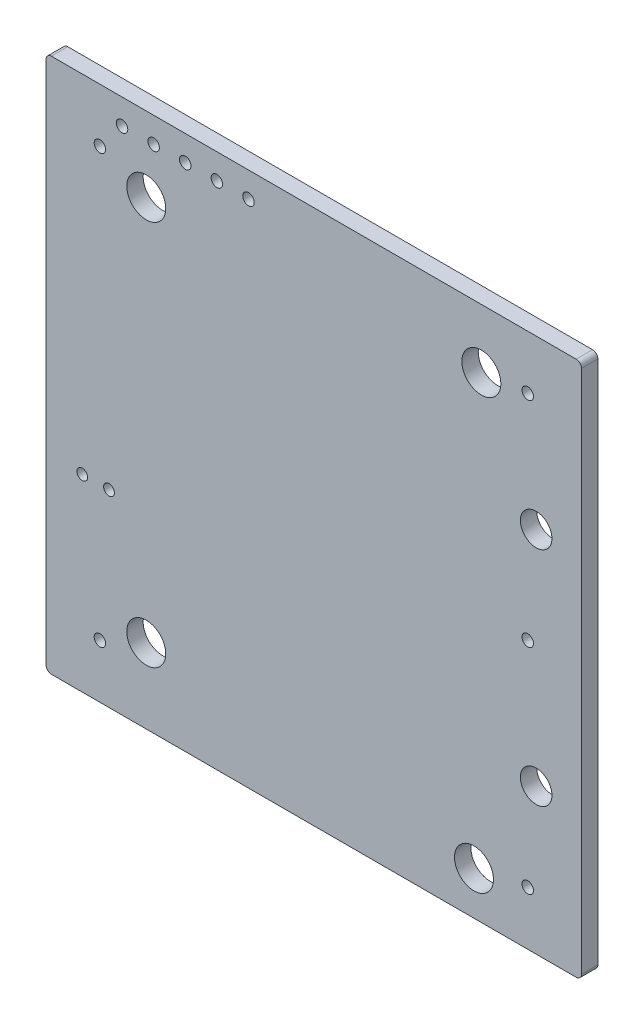
ISO-10303-21;
HEADER;
FILE_DESCRIPTION(('STEP AP214'),'2;1');
FILE_NAME('part.step','',(''),(''),'','','');
FILE_SCHEMA(('AUTOMOTIVE_DESIGN { 1 0 10303 214 1 1 1 1 }'));
ENDSEC;
DATA;
#1=APPLICATION_CONTEXT('core data for automotive mechanical design processes');
#2=APPLICATION_PROTOCOL_DEFINITION('international standard','automotive_design',2000,#1);
#3=PRODUCT_CONTEXT('',#1,'mechanical');
#4=PRODUCT('Part','Part','',(#3));
#5=PRODUCT_RELATED_PRODUCT_CATEGORY('part','',(#4));
#6=PRODUCT_DEFINITION_FORMATION('','',#4);
#7=PRODUCT_DEFINITION_CONTEXT('part definition',#1,'design');
#8=PRODUCT_DEFINITION('design','',#6,#7);
#9=PRODUCT_DEFINITION_SHAPE('','',#8);
#10=(LENGTH_UNIT() NAMED_UNIT(*) SI_UNIT(.MILLI.,.METRE.));
#11=(NAMED_UNIT(*) PLANE_ANGLE_UNIT() SI_UNIT($,.RADIAN.));
#12=(NAMED_UNIT(*) SI_UNIT($,.STERADIAN.) SOLID_ANGLE_UNIT());
#13=UNCERTAINTY_MEASURE_WITH_UNIT(LENGTH_MEASURE(1.E-05),#10,'distance_accuracy_value','');
#14=(GEOMETRIC_REPRESENTATION_CONTEXT(3) GLOBAL_UNCERTAINTY_ASSIGNED_CONTEXT((#13)) GLOBAL_UNIT_ASSIGNED_CONTEXT((#10,
#11,#12)) REPRESENTATION_CONTEXT('',''));
#15=CARTESIAN_POINT('',(0.,0.,0.));
#16=DIRECTION('',(0.,0.,1.));
#17=DIRECTION('',(1.,0.,0.));
#18=AXIS2_PLACEMENT_3D('',#15,#16,#17);
#19=CARTESIAN_POINT('',(0.496788095558,50.30321733912,0.));
#20=DIRECTION('',(0.,0.,-1.));
#21=DIRECTION('',(-1.,0.,0.));
#22=AXIS2_PLACEMENT_3D('',#19,#20,#21);
#23=CYLINDRICAL_SURFACE('',#22,0.496793043914);
#24=DIRECTION('',(0.,0.,1.));
#25=VECTOR('',#24,1.);
#26=CARTESIAN_POINT('',(0.5,50.8,0.));
#27=LINE('',#26,#25);
#28=CARTESIAN_POINT('',(0.500000000014714,50.8,0.));
#29=VERTEX_POINT('',#28);
#30=CARTESIAN_POINT('',(0.500000000014714,50.8,1.55530804));
#31=VERTEX_POINT('',#30);
#32=EDGE_CURVE('E120',#29,#31,#27,.T.);
#33=ORIENTED_EDGE('',*,*,#32,.F.);
#34=CARTESIAN_POINT('',(0.496788095558,50.30321733912,0.));
#35=DIRECTION('',(0.,0.,-1.));
#36=DIRECTION('',(-1.,0.,0.));
#37=AXIS2_PLACEMENT_3D('',#34,#35,#36);
#38=CIRCLE('',#37,0.496793043914);
#39=CARTESIAN_POINT('',(-2.11256793308801E-13,50.301,0.));
#40=VERTEX_POINT('',#39);
#41=EDGE_CURVE('E20',#29,#40,#38,.F.);
#42=ORIENTED_EDGE('',*,*,#41,.T.);
#43=DIRECTION('',(0.,0.,1.));
#44=VECTOR('',#43,1.);
#45=CARTESIAN_POINT('',(0.,50.301,0.));
#46=LINE('',#45,#44);
#47=CARTESIAN_POINT('',(-2.11256793308801E-13,50.301,1.55530804));
#48=VERTEX_POINT('',#47);
#49=EDGE_CURVE('E123',#48,#40,#46,.F.);
#50=ORIENTED_EDGE('',*,*,#49,.F.);
#51=CARTESIAN_POINT('',(0.496788095558,50.30321733912,1.55530804));
#52=DIRECTION('',(0.,0.,-1.));
#53=DIRECTION('',(-1.,0.,0.));
#54=AXIS2_PLACEMENT_3D('',#51,#52,#53);
#55=CIRCLE('',#54,0.496793043914);
#56=EDGE_CURVE('E233',#48,#31,#55,.T.);
#57=ORIENTED_EDGE('',*,*,#56,.T.);
#58=EDGE_LOOP('',(#33,#42,#50,#57));
#59=FACE_BOUND('',#58,.T.);
#60=ADVANCED_FACE('F17',(#59),#23,.T.);
#61=CARTESIAN_POINT('',(50.301519230769,50.301519230769,0.));
#62=DIRECTION('',(0.,0.,-1.));
#63=DIRECTION('',(-1.,0.,0.));
#64=AXIS2_PLACEMENT_3D('',#61,#62,#63);
#65=CYLINDRICAL_SURFACE('',#64,0.498483084322);
#66=DIRECTION('',(0.,0.,-1.));
#67=VECTOR('',#66,1.);
#68=CARTESIAN_POINT('',(50.8,50.3,0.));
#69=LINE('',#68,#67);
#70=CARTESIAN_POINT('',(50.8,50.3,0.));
#71=VERTEX_POINT('',#70);
#72=CARTESIAN_POINT('',(50.8,50.3,1.55530804));
#73=VERTEX_POINT('',#72);
#74=EDGE_CURVE('E110',#71,#73,#69,.F.);
#75=ORIENTED_EDGE('',*,*,#74,.F.);
#76=CARTESIAN_POINT('',(50.301519230769,50.301519230769,0.));
#77=DIRECTION('',(0.,0.,-1.));
#78=DIRECTION('',(-1.,0.,0.));
#79=AXIS2_PLACEMENT_3D('',#76,#77,#78);
#80=CIRCLE('',#79,0.498483084322);
#81=CARTESIAN_POINT('',(50.3,50.8,0.));
#82=VERTEX_POINT('',#81);
#83=EDGE_CURVE('E238',#71,#82,#80,.F.);
#84=ORIENTED_EDGE('',*,*,#83,.T.);
#85=DIRECTION('',(0.,0.,1.));
#86=VECTOR('',#85,1.);
#87=CARTESIAN_POINT('',(50.3,50.8,0.));
#88=LINE('',#87,#86);
#89=CARTESIAN_POINT('',(50.3,50.8,1.55530804));
#90=VERTEX_POINT('',#89);
#91=EDGE_CURVE('E112',#90,#82,#88,.F.);
#92=ORIENTED_EDGE('',*,*,#91,.F.);
#93=CARTESIAN_POINT('',(50.301519230769,50.301519230769,1.55530804));
#94=DIRECTION('',(0.,0.,-1.));
#95=DIRECTION('',(-1.,0.,0.));
#96=AXIS2_PLACEMENT_3D('',#93,#94,#95);
#97=CIRCLE('',#96,0.498483084322);
#98=EDGE_CURVE('E99',#90,#73,#97,.T.);
#99=ORIENTED_EDGE('',*,*,#98,.T.);
#100=EDGE_LOOP('',(#75,#84,#92,#99));
#101=FACE_BOUND('',#100,.T.);
#102=ADVANCED_FACE('F242',(#101),#65,.T.);
#103=CARTESIAN_POINT('',(50.301519230769,0.498480769231,0.));
#104=DIRECTION('',(0.,0.,-1.));
#105=DIRECTION('',(-1.,0.,0.));
#106=AXIS2_PLACEMENT_3D('',#103,#104,#105);
#107=CYLINDRICAL_SURFACE('',#106,0.498483084322);
#108=DIRECTION('',(0.,0.,-1.));
#109=VECTOR('',#108,1.);
#110=CARTESIAN_POINT('',(50.3,0.,0.));
#111=LINE('',#110,#109);
#112=CARTESIAN_POINT('',(50.3,0.,0.));
#113=VERTEX_POINT('',#112);
#114=CARTESIAN_POINT('',(50.3,0.,1.55530804));
#115=VERTEX_POINT('',#114);
#116=EDGE_CURVE('E106',#113,#115,#111,.F.);
#117=ORIENTED_EDGE('',*,*,#116,.F.);
#118=CARTESIAN_POINT('',(50.301519230769,0.498480769231,0.));
#119=DIRECTION('',(0.,0.,-1.));
#120=DIRECTION('',(-1.,0.,0.));
#121=AXIS2_PLACEMENT_3D('',#118,#119,#120);
#122=CIRCLE('',#121,0.498483084322);
#123=CARTESIAN_POINT('',(50.8,0.5,0.));
#124=VERTEX_POINT('',#123);
#125=EDGE_CURVE('E35',#113,#124,#122,.F.);
#126=ORIENTED_EDGE('',*,*,#125,.T.);
#127=DIRECTION('',(0.,0.,-1.));
#128=VECTOR('',#127,1.);
#129=CARTESIAN_POINT('',(50.8,0.5,0.));
#130=LINE('',#129,#128);
#131=CARTESIAN_POINT('',(50.8,0.5,1.55530804));
#132=VERTEX_POINT('',#131);
#133=EDGE_CURVE('E102',#132,#124,#130,.T.);
#134=ORIENTED_EDGE('',*,*,#133,.F.);
#135=CARTESIAN_POINT('',(50.301519230769,0.498480769231,1.55530804));
#136=DIRECTION('',(0.,0.,-1.));
#137=DIRECTION('',(-1.,0.,0.));
#138=AXIS2_PLACEMENT_3D('',#135,#136,#137);
#139=CIRCLE('',#138,0.498483084322);
#140=EDGE_CURVE('E88',#132,#115,#139,.T.);
#141=ORIENTED_EDGE('',*,*,#140,.T.);
#142=EDGE_LOOP('',(#117,#126,#134,#141));
#143=FACE_BOUND('',#142,.T.);
#144=ADVANCED_FACE('F103',(#143),#107,.T.);
#145=CARTESIAN_POINT('',(0.498480769231,0.498480769231,0.));
#146=DIRECTION('',(0.,0.,-1.));
#147=DIRECTION('',(-1.,0.,0.));
#148=AXIS2_PLACEMENT_3D('',#145,#146,#147);
#149=CYLINDRICAL_SURFACE('',#148,0.498483084322);
#150=DIRECTION('',(0.,0.,1.));
#151=VECTOR('',#150,1.);
#152=CARTESIAN_POINT('',(0.,0.5,0.));
#153=LINE('',#152,#151);
#154=CARTESIAN_POINT('',(0.,0.5,0.));
#155=VERTEX_POINT('',#154);
#156=CARTESIAN_POINT('',(0.,0.5,1.55530804));
#157=VERTEX_POINT('',#156);
#158=EDGE_CURVE('E98',#155,#157,#153,.T.);
#159=ORIENTED_EDGE('',*,*,#158,.F.);
#160=CARTESIAN_POINT('',(0.498480769231,0.498480769231,0.));
#161=DIRECTION('',(0.,0.,-1.));
#162=DIRECTION('',(-1.,0.,0.));
#163=AXIS2_PLACEMENT_3D('',#160,#161,#162);
#164=CIRCLE('',#163,0.498483084322);
#165=CARTESIAN_POINT('',(0.5,0.,0.));
#166=VERTEX_POINT('',#165);
#167=EDGE_CURVE('E59',#155,#166,#164,.F.);
#168=ORIENTED_EDGE('',*,*,#167,.T.);
#169=DIRECTION('',(0.,0.,-1.));
#170=VECTOR('',#169,1.);
#171=CARTESIAN_POINT('',(0.5,0.,0.));
#172=LINE('',#171,#170);
#173=CARTESIAN_POINT('',(0.5,0.,1.55530804));
#174=VERTEX_POINT('',#173);
#175=EDGE_CURVE('E230',#174,#166,#172,.T.);
#176=ORIENTED_EDGE('',*,*,#175,.F.);
#177=CARTESIAN_POINT('',(0.498480769231,0.498480769231,1.55530804));
#178=DIRECTION('',(0.,0.,-1.));
#179=DIRECTION('',(-1.,0.,0.));
#180=AXIS2_PLACEMENT_3D('',#177,#178,#179);
#181=CIRCLE('',#180,0.498483084322);
#182=EDGE_CURVE('E235',#174,#157,#181,.T.);
#183=ORIENTED_EDGE('',*,*,#182,.T.);
#184=EDGE_LOOP('',(#159,#168,#176,#183));
#185=FACE_BOUND('',#184,.T.);
#186=ADVANCED_FACE('F268',(#185),#149,.T.);
#187=CARTESIAN_POINT('',(25.399913511173,25.400086411478,1.55530804));
#188=DIRECTION('',(0.,0.,-1.));
#189=DIRECTION('',(-1.,0.,0.));
#190=AXIS2_PLACEMENT_3D('',#187,#188,#189);
#191=PLANE('',#190);
#192=CARTESIAN_POINT('',(45.7,45.7,1.55530804));
#193=DIRECTION('',(0.,0.,-1.));
#194=DIRECTION('',(-1.,0.,0.));
#195=AXIS2_PLACEMENT_3D('',#192,#193,#194);
#196=CIRCLE('',#195,0.545);
#197=CARTESIAN_POINT('',(45.155,45.7,1.55530804));
#198=VERTEX_POINT('',#197);
#199=EDGE_CURVE('E176',#198,#198,#196,.T.);
#200=ORIENTED_EDGE('',*,*,#199,.T.);
#201=EDGE_LOOP('',(#200));
#202=FACE_BOUND('',#201,.T.);
#203=CARTESIAN_POINT('',(41.3,45.2,1.55530804));
#204=DIRECTION('',(0.,0.,-1.));
#205=DIRECTION('',(-1.,0.,0.));
#206=AXIS2_PLACEMENT_3D('',#203,#204,#205);
#207=CIRCLE('',#206,1.85);
#208=CARTESIAN_POINT('',(39.45,45.2,1.55530804));
#209=VERTEX_POINT('',#208);
#210=EDGE_CURVE('E180',#209,#209,#207,.T.);
#211=ORIENTED_EDGE('',*,*,#210,.T.);
#212=EDGE_LOOP('',(#211));
#213=FACE_BOUND('',#212,.T.);
#214=CARTESIAN_POINT('',(46.5,34.9,1.55530804));
#215=DIRECTION('',(0.,0.,-1.));
#216=DIRECTION('',(-1.,0.,0.));
#217=AXIS2_PLACEMENT_3D('',#214,#215,#216);
#218=CIRCLE('',#217,1.5);
#219=CARTESIAN_POINT('',(45.,34.9,1.55530804));
#220=VERTEX_POINT('',#219);
#221=EDGE_CURVE('E183',#220,#220,#218,.T.);
#222=ORIENTED_EDGE('',*,*,#221,.T.);
#223=EDGE_LOOP('',(#222));
#224=FACE_BOUND('',#223,.T.);
#225=CARTESIAN_POINT('',(16.2,48.4,1.55530804));
#226=DIRECTION('',(0.,0.,-1.));
#227=DIRECTION('',(-1.,0.,0.));
#228=AXIS2_PLACEMENT_3D('',#225,#226,#227);
#229=CIRCLE('',#228,0.545);
#230=CARTESIAN_POINT('',(15.655,48.4,1.55530804));
#231=VERTEX_POINT('',#230);
#232=EDGE_CURVE('E186',#231,#231,#229,.T.);
#233=ORIENTED_EDGE('',*,*,#232,.T.);
#234=EDGE_LOOP('',(#233));
#235=FACE_BOUND('',#234,.T.);
#236=CARTESIAN_POINT('',(19.2,48.4,1.55530804));
#237=DIRECTION('',(0.,0.,-1.));
#238=DIRECTION('',(-1.,0.,0.));
#239=AXIS2_PLACEMENT_3D('',#236,#237,#238);
#240=CIRCLE('',#239,0.545);
#241=CARTESIAN_POINT('',(18.655,48.4,1.55530804));
#242=VERTEX_POINT('',#241);
#243=EDGE_CURVE('E189',#242,#242,#240,.T.);
#244=ORIENTED_EDGE('',*,*,#243,.T.);
#245=EDGE_LOOP('',(#244));
#246=FACE_BOUND('',#245,.T.);
#247=CARTESIAN_POINT('',(45.7,25.4,1.55530804));
#248=DIRECTION('',(0.,0.,-1.));
#249=DIRECTION('',(-1.,0.,0.));
#250=AXIS2_PLACEMENT_3D('',#247,#248,#249);
#251=CIRCLE('',#250,0.545);
#252=CARTESIAN_POINT('',(45.155,25.4,1.55530804));
#253=VERTEX_POINT('',#252);
#254=EDGE_CURVE('E192',#253,#253,#251,.T.);
#255=ORIENTED_EDGE('',*,*,#254,.T.);
#256=EDGE_LOOP('',(#255));
#257=FACE_BOUND('',#256,.T.);
#258=CARTESIAN_POINT('',(46.5,13.8,1.55530804));
#259=DIRECTION('',(0.,0.,-1.));
#260=DIRECTION('',(-1.,0.,0.));
#261=AXIS2_PLACEMENT_3D('',#258,#259,#260);
#262=CIRCLE('',#261,1.5);
#263=CARTESIAN_POINT('',(45.,13.8,1.55530804));
#264=VERTEX_POINT('',#263);
#265=EDGE_CURVE('E195',#264,#264,#262,.T.);
#266=ORIENTED_EDGE('',*,*,#265,.T.);
#267=EDGE_LOOP('',(#266));
#268=FACE_BOUND('',#267,.T.);
#269=CARTESIAN_POINT('',(40.6,4.1,1.55530804));
#270=DIRECTION('',(0.,0.,-1.));
#271=DIRECTION('',(-1.,0.,0.));
#272=AXIS2_PLACEMENT_3D('',#269,#270,#271);
#273=CIRCLE('',#272,1.85);
#274=CARTESIAN_POINT('',(38.75,4.1,1.55530804));
#275=VERTEX_POINT('',#274);
#276=EDGE_CURVE('E198',#275,#275,#273,.T.);
#277=ORIENTED_EDGE('',*,*,#276,.T.);
#278=EDGE_LOOP('',(#277));
#279=FACE_BOUND('',#278,.T.);
#280=CARTESIAN_POINT('',(45.7,5.1,1.55530804));
#281=DIRECTION('',(0.,0.,-1.));
#282=DIRECTION('',(-1.,0.,0.));
#283=AXIS2_PLACEMENT_3D('',#280,#281,#282);
#284=CIRCLE('',#283,0.545);
#285=CARTESIAN_POINT('',(45.155,5.1,1.55530804));
#286=VERTEX_POINT('',#285);
#287=EDGE_CURVE('E201',#286,#286,#284,.T.);
#288=ORIENTED_EDGE('',*,*,#287,.T.);
#289=EDGE_LOOP('',(#288));
#290=FACE_BOUND('',#289,.T.);
#291=CARTESIAN_POINT('',(13.2,48.4,1.55530804));
#292=DIRECTION('',(0.,0.,-1.));
#293=DIRECTION('',(-1.,0.,0.));
#294=AXIS2_PLACEMENT_3D('',#291,#292,#293);
#295=CIRCLE('',#294,0.545);
#296=CARTESIAN_POINT('',(12.655,48.4,1.55530804));
#297=VERTEX_POINT('',#296);
#298=EDGE_CURVE('E204',#297,#297,#295,.T.);
#299=ORIENTED_EDGE('',*,*,#298,.T.);
#300=EDGE_LOOP('',(#299));
#301=FACE_BOUND('',#300,.T.);
#302=CARTESIAN_POINT('',(10.2,48.4,1.55530804));
#303=DIRECTION('',(0.,0.,-1.));
#304=DIRECTION('',(-1.,0.,0.));
#305=AXIS2_PLACEMENT_3D('',#302,#303,#304);
#306=CIRCLE('',#305,0.545);
#307=CARTESIAN_POINT('',(9.655,48.4,1.55530804));
#308=VERTEX_POINT('',#307);
#309=EDGE_CURVE('E207',#308,#308,#306,.T.);
#310=ORIENTED_EDGE('',*,*,#309,.T.);
#311=EDGE_LOOP('',(#310));
#312=FACE_BOUND('',#311,.T.);
#313=CARTESIAN_POINT('',(9.5,43.7,1.55530804));
#314=DIRECTION('',(0.,0.,-1.));
#315=DIRECTION('',(-1.,0.,0.));
#316=AXIS2_PLACEMENT_3D('',#313,#314,#315);
#317=CIRCLE('',#316,1.85);
#318=CARTESIAN_POINT('',(7.65,43.7,1.55530804));
#319=VERTEX_POINT('',#318);
#320=EDGE_CURVE('E210',#319,#319,#317,.T.);
#321=ORIENTED_EDGE('',*,*,#320,.T.);
#322=EDGE_LOOP('',(#321));
#323=FACE_BOUND('',#322,.T.);
#324=CARTESIAN_POINT('',(7.2,48.4,1.55530804));
#325=DIRECTION('',(0.,0.,-1.));
#326=DIRECTION('',(-1.,0.,0.));
#327=AXIS2_PLACEMENT_3D('',#324,#325,#326);
#328=CIRCLE('',#327,0.545);
#329=CARTESIAN_POINT('',(6.655,48.4,1.55530804));
#330=VERTEX_POINT('',#329);
#331=EDGE_CURVE('E213',#330,#330,#328,.T.);
#332=ORIENTED_EDGE('',*,*,#331,.T.);
#333=EDGE_LOOP('',(#332));
#334=FACE_BOUND('',#333,.T.);
#335=CARTESIAN_POINT('',(5.1,45.7,1.55530804));
#336=DIRECTION('',(0.,0.,-1.));
#337=DIRECTION('',(-1.,0.,0.));
#338=AXIS2_PLACEMENT_3D('',#335,#336,#337);
#339=CIRCLE('',#338,0.545);
#340=CARTESIAN_POINT('',(4.555,45.7,1.55530804));
#341=VERTEX_POINT('',#340);
#342=EDGE_CURVE('E216',#341,#341,#339,.T.);
#343=ORIENTED_EDGE('',*,*,#342,.T.);
#344=EDGE_LOOP('',(#343));
#345=FACE_BOUND('',#344,.T.);
#346=CARTESIAN_POINT('',(5.965,17.9,1.55530804));
#347=DIRECTION('',(0.,0.,-1.));
#348=DIRECTION('',(-1.,0.,0.));
#349=AXIS2_PLACEMENT_3D('',#346,#347,#348);
#350=CIRCLE('',#349,0.51);
#351=CARTESIAN_POINT('',(5.455,17.9,1.55530804));
#352=VERTEX_POINT('',#351);
#353=EDGE_CURVE('E219',#352,#352,#350,.T.);
#354=ORIENTED_EDGE('',*,*,#353,.T.);
#355=EDGE_LOOP('',(#354));
#356=FACE_BOUND('',#355,.T.);
#357=CARTESIAN_POINT('',(9.5,7.1,1.55530804));
#358=DIRECTION('',(0.,0.,-1.));
#359=DIRECTION('',(-1.,0.,0.));
#360=AXIS2_PLACEMENT_3D('',#357,#358,#359);
#361=CIRCLE('',#360,1.85);
#362=CARTESIAN_POINT('',(7.65,7.1,1.55530804));
#363=VERTEX_POINT('',#362);
#364=EDGE_CURVE('E222',#363,#363,#361,.T.);
#365=ORIENTED_EDGE('',*,*,#364,.T.);
#366=EDGE_LOOP('',(#365));
#367=FACE_BOUND('',#366,.T.);
#368=CARTESIAN_POINT('',(3.425,17.9,1.55530804));
#369=DIRECTION('',(0.,0.,-1.));
#370=DIRECTION('',(-1.,0.,0.));
#371=AXIS2_PLACEMENT_3D('',#368,#369,#370);
#372=CIRCLE('',#371,0.51);
#373=CARTESIAN_POINT('',(2.915,17.9,1.55530804));
#374=VERTEX_POINT('',#373);
#375=EDGE_CURVE('E225',#374,#374,#372,.T.);
#376=ORIENTED_EDGE('',*,*,#375,.T.);
#377=EDGE_LOOP('',(#376));
#378=FACE_BOUND('',#377,.T.);
#379=CARTESIAN_POINT('',(5.1,5.1,1.55530804));
#380=DIRECTION('',(0.,0.,-1.));
#381=DIRECTION('',(-1.,0.,0.));
#382=AXIS2_PLACEMENT_3D('',#379,#380,#381);
#383=CIRCLE('',#382,0.545);
#384=CARTESIAN_POINT('',(4.555,5.1,1.55530804));
#385=VERTEX_POINT('',#384);
#386=EDGE_CURVE('E228',#385,#385,#383,.T.);
#387=ORIENTED_EDGE('',*,*,#386,.T.);
#388=EDGE_LOOP('',(#387));
#389=FACE_BOUND('',#388,.T.);
#390=ORIENTED_EDGE('',*,*,#140,.F.);
#391=DIRECTION('',(0.,1.,0.));
#392=VECTOR('',#391,1.);
#393=CARTESIAN_POINT('',(50.8,50.3,1.55530804));
#394=LINE('',#393,#392);
#395=EDGE_CURVE('E92',#73,#132,#394,.F.);
#396=ORIENTED_EDGE('',*,*,#395,.F.);
#397=ORIENTED_EDGE('',*,*,#98,.F.);
#398=DIRECTION('',(1.,0.,0.));
#399=VECTOR('',#398,1.);
#400=CARTESIAN_POINT('',(0.5,50.8,1.55530804));
#401=LINE('',#400,#399);
#402=EDGE_CURVE('E117',#31,#90,#401,.T.);
#403=ORIENTED_EDGE('',*,*,#402,.F.);
#404=ORIENTED_EDGE('',*,*,#56,.F.);
#405=DIRECTION('',(0.,1.,0.));
#406=VECTOR('',#405,1.);
#407=CARTESIAN_POINT('',(0.,0.5,1.55530804));
#408=LINE('',#407,#406);
#409=EDGE_CURVE('E121',#157,#48,#408,.T.);
#410=ORIENTED_EDGE('',*,*,#409,.F.);
#411=ORIENTED_EDGE('',*,*,#182,.F.);
#412=DIRECTION('',(1.,0.,0.));
#413=VECTOR('',#412,1.);
#414=CARTESIAN_POINT('',(50.3,0.,1.55530804));
#415=LINE('',#414,#413);
#416=EDGE_CURVE('E95',#115,#174,#415,.F.);
#417=ORIENTED_EDGE('',*,*,#416,.F.);
#418=EDGE_LOOP('',(#390,#396,#397,#403,#404,#410,#411,#417));
#419=FACE_BOUND('',#418,.T.);
#420=ADVANCED_FACE('F90',(#202,#213,#224,#235,#246,#257,#268,#279,#290,#301,#312,#323,#334,#345,
#356,#367,#378,#389,#419),#191,.F.);
#421=CARTESIAN_POINT('',(0.,0.5,0.));
#422=DIRECTION('',(-1.,0.,0.));
#423=DIRECTION('',(0.,0.,1.));
#424=AXIS2_PLACEMENT_3D('',#421,#422,#423);
#425=PLANE('',#424);
#426=ORIENTED_EDGE('',*,*,#49,.T.);
#427=DIRECTION('',(0.,1.,0.));
#428=VECTOR('',#427,1.);
#429=CARTESIAN_POINT('',(0.,25.400086411478,0.));
#430=LINE('',#429,#428);
#431=EDGE_CURVE('E179',#155,#40,#430,.T.);
#432=ORIENTED_EDGE('',*,*,#431,.F.);
#433=ORIENTED_EDGE('',*,*,#158,.T.);
#434=ORIENTED_EDGE('',*,*,#409,.T.);
#435=EDGE_LOOP('',(#426,#432,#433,#434));
#436=FACE_BOUND('',#435,.T.);
#437=ADVANCED_FACE('F264',(#436),#425,.T.);
#438=CARTESIAN_POINT('',(0.5,50.8,0.));
#439=DIRECTION('',(0.,1.,0.));
#440=DIRECTION('',(0.,0.,1.));
#441=AXIS2_PLACEMENT_3D('',#438,#439,#440);
#442=PLANE('',#441);
#443=ORIENTED_EDGE('',*,*,#91,.T.);
#444=DIRECTION('',(-1.,0.,0.));
#445=VECTOR('',#444,1.);
#446=CARTESIAN_POINT('',(25.399913511173,50.8,0.));
#447=LINE('',#446,#445);
#448=EDGE_CURVE('E247',#29,#82,#447,.F.);
#449=ORIENTED_EDGE('',*,*,#448,.F.);
#450=ORIENTED_EDGE('',*,*,#32,.T.);
#451=ORIENTED_EDGE('',*,*,#402,.T.);
#452=EDGE_LOOP('',(#443,#449,#450,#451));
#453=FACE_BOUND('',#452,.T.);
#454=ADVANCED_FACE('F245',(#453),#442,.T.);
#455=CARTESIAN_POINT('',(50.8,50.3,0.));
#456=DIRECTION('',(1.,0.,0.));
#457=DIRECTION('',(0.,0.,-1.));
#458=AXIS2_PLACEMENT_3D('',#455,#456,#457);
#459=PLANE('',#458);
#460=ORIENTED_EDGE('',*,*,#133,.T.);
#461=DIRECTION('',(0.,1.,0.));
#462=VECTOR('',#461,1.);
#463=CARTESIAN_POINT('',(50.8,25.400086411478,0.));
#464=LINE('',#463,#462);
#465=EDGE_CURVE('E251',#71,#124,#464,.F.);
#466=ORIENTED_EDGE('',*,*,#465,.F.);
#467=ORIENTED_EDGE('',*,*,#74,.T.);
#468=ORIENTED_EDGE('',*,*,#395,.T.);
#469=EDGE_LOOP('',(#460,#466,#467,#468));
#470=FACE_BOUND('',#469,.T.);
#471=ADVANCED_FACE('F108',(#470),#459,.T.);
#472=CARTESIAN_POINT('',(50.3,0.,0.));
#473=DIRECTION('',(0.,-1.,0.));
#474=DIRECTION('',(0.,0.,-1.));
#475=AXIS2_PLACEMENT_3D('',#472,#473,#474);
#476=PLANE('',#475);
#477=ORIENTED_EDGE('',*,*,#175,.T.);
#478=DIRECTION('',(-1.,0.,0.));
#479=VECTOR('',#478,1.);
#480=CARTESIAN_POINT('',(25.399913511173,0.,0.));
#481=LINE('',#480,#479);
#482=EDGE_CURVE('E175',#113,#166,#481,.T.);
#483=ORIENTED_EDGE('',*,*,#482,.F.);
#484=ORIENTED_EDGE('',*,*,#116,.T.);
#485=ORIENTED_EDGE('',*,*,#416,.T.);
#486=EDGE_LOOP('',(#477,#483,#484,#485));
#487=FACE_BOUND('',#486,.T.);
#488=ADVANCED_FACE('F271',(#487),#476,.T.);
#489=CARTESIAN_POINT('',(5.1,5.1,0.));
#490=DIRECTION('',(0.,0.,-1.));
#491=DIRECTION('',(-1.,0.,0.));
#492=AXIS2_PLACEMENT_3D('',#489,#490,#491);
#493=CYLINDRICAL_SURFACE('',#492,0.545);
#494=ORIENTED_EDGE('',*,*,#386,.F.);
#495=EDGE_LOOP('',(#494));
#496=FACE_BOUND('',#495,.T.);
#497=CARTESIAN_POINT('',(5.1,5.1,0.));
#498=DIRECTION('',(0.,0.,-1.));
#499=DIRECTION('',(-1.,0.,0.));
#500=AXIS2_PLACEMENT_3D('',#497,#498,#499);
#501=CIRCLE('',#500,0.545);
#502=CARTESIAN_POINT('',(4.555,5.1,0.));
#503=VERTEX_POINT('',#502);
#504=EDGE_CURVE('E172',#503,#503,#501,.F.);
#505=ORIENTED_EDGE('',*,*,#504,.F.);
#506=EDGE_LOOP('',(#505));
#507=FACE_BOUND('',#506,.T.);
#508=ADVANCED_FACE('F273',(#496,#507),#493,.F.);
#509=CARTESIAN_POINT('',(3.425,17.9,0.));
#510=DIRECTION('',(0.,0.,-1.));
#511=DIRECTION('',(-1.,0.,0.));
#512=AXIS2_PLACEMENT_3D('',#509,#510,#511);
#513=CYLINDRICAL_SURFACE('',#512,0.51);
#514=ORIENTED_EDGE('',*,*,#375,.F.);
#515=EDGE_LOOP('',(#514));
#516=FACE_BOUND('',#515,.T.);
#517=CARTESIAN_POINT('',(3.425,17.9,0.));
#518=DIRECTION('',(0.,0.,-1.));
#519=DIRECTION('',(-1.,0.,0.));
#520=AXIS2_PLACEMENT_3D('',#517,#518,#519);
#521=CIRCLE('',#520,0.51);
#522=CARTESIAN_POINT('',(2.915,17.9,0.));
#523=VERTEX_POINT('',#522);
#524=EDGE_CURVE('E169',#523,#523,#521,.F.);
#525=ORIENTED_EDGE('',*,*,#524,.F.);
#526=EDGE_LOOP('',(#525));
#527=FACE_BOUND('',#526,.T.);
#528=ADVANCED_FACE('F280',(#516,#527),#513,.F.);
#529=CARTESIAN_POINT('',(9.5,7.1,0.));
#530=DIRECTION('',(0.,0.,-1.));
#531=DIRECTION('',(-1.,0.,0.));
#532=AXIS2_PLACEMENT_3D('',#529,#530,#531);
#533=CYLINDRICAL_SURFACE('',#532,1.85);
#534=ORIENTED_EDGE('',*,*,#364,.F.);
#535=EDGE_LOOP('',(#534));
#536=FACE_BOUND('',#535,.T.);
#537=CARTESIAN_POINT('',(9.5,7.1,0.));
#538=DIRECTION('',(0.,0.,-1.));
#539=DIRECTION('',(-1.,0.,0.));
#540=AXIS2_PLACEMENT_3D('',#537,#538,#539);
#541=CIRCLE('',#540,1.85);
#542=CARTESIAN_POINT('',(7.65,7.1,0.));
#543=VERTEX_POINT('',#542);
#544=EDGE_CURVE('E166',#543,#543,#541,.F.);
#545=ORIENTED_EDGE('',*,*,#544,.F.);
#546=EDGE_LOOP('',(#545));
#547=FACE_BOUND('',#546,.T.);
#548=ADVANCED_FACE('F350',(#536,#547),#533,.F.);
#549=CARTESIAN_POINT('',(5.965,17.9,0.));
#550=DIRECTION('',(0.,0.,-1.));
#551=DIRECTION('',(-1.,0.,0.));
#552=AXIS2_PLACEMENT_3D('',#549,#550,#551);
#553=CYLINDRICAL_SURFACE('',#552,0.51);
#554=ORIENTED_EDGE('',*,*,#353,.F.);
#555=EDGE_LOOP('',(#554));
#556=FACE_BOUND('',#555,.T.);
#557=CARTESIAN_POINT('',(5.965,17.9,0.));
#558=DIRECTION('',(0.,0.,-1.));
#559=DIRECTION('',(-1.,0.,0.));
#560=AXIS2_PLACEMENT_3D('',#557,#558,#559);
#561=CIRCLE('',#560,0.51);
#562=CARTESIAN_POINT('',(5.455,17.9,0.));
#563=VERTEX_POINT('',#562);
#564=EDGE_CURVE('E163',#563,#563,#561,.F.);
#565=ORIENTED_EDGE('',*,*,#564,.F.);
#566=EDGE_LOOP('',(#565));
#567=FACE_BOUND('',#566,.T.);
#568=ADVANCED_FACE('F346',(#556,#567),#553,.F.);
#569=CARTESIAN_POINT('',(5.1,45.7,0.));
#570=DIRECTION('',(0.,0.,-1.));
#571=DIRECTION('',(-1.,0.,0.));
#572=AXIS2_PLACEMENT_3D('',#569,#570,#571);
#573=CYLINDRICAL_SURFACE('',#572,0.545);
#574=ORIENTED_EDGE('',*,*,#342,.F.);
#575=EDGE_LOOP('',(#574));
#576=FACE_BOUND('',#575,.T.);
#577=CARTESIAN_POINT('',(5.1,45.7,0.));
#578=DIRECTION('',(0.,0.,-1.));
#579=DIRECTION('',(-1.,0.,0.));
#580=AXIS2_PLACEMENT_3D('',#577,#578,#579);
#581=CIRCLE('',#580,0.545);
#582=CARTESIAN_POINT('',(4.555,45.7,0.));
#583=VERTEX_POINT('',#582);
#584=EDGE_CURVE('E160',#583,#583,#581,.F.);
#585=ORIENTED_EDGE('',*,*,#584,.F.);
#586=EDGE_LOOP('',(#585));
#587=FACE_BOUND('',#586,.T.);
#588=ADVANCED_FACE('F342',(#576,#587),#573,.F.);
#589=CARTESIAN_POINT('',(7.2,48.4,0.));
#590=DIRECTION('',(0.,0.,-1.));
#591=DIRECTION('',(-1.,0.,0.));
#592=AXIS2_PLACEMENT_3D('',#589,#590,#591);
#593=CYLINDRICAL_SURFACE('',#592,0.545);
#594=ORIENTED_EDGE('',*,*,#331,.F.);
#595=EDGE_LOOP('',(#594));
#596=FACE_BOUND('',#595,.T.);
#597=CARTESIAN_POINT('',(7.2,48.4,0.));
#598=DIRECTION('',(0.,0.,-1.));
#599=DIRECTION('',(-1.,0.,0.));
#600=AXIS2_PLACEMENT_3D('',#597,#598,#599);
#601=CIRCLE('',#600,0.545);
#602=CARTESIAN_POINT('',(6.655,48.4,0.));
#603=VERTEX_POINT('',#602);
#604=EDGE_CURVE('E157',#603,#603,#601,.F.);
#605=ORIENTED_EDGE('',*,*,#604,.F.);
#606=EDGE_LOOP('',(#605));
#607=FACE_BOUND('',#606,.T.);
#608=ADVANCED_FACE('F338',(#596,#607),#593,.F.);
#609=CARTESIAN_POINT('',(9.5,43.7,0.));
#610=DIRECTION('',(0.,0.,-1.));
#611=DIRECTION('',(-1.,0.,0.));
#612=AXIS2_PLACEMENT_3D('',#609,#610,#611);
#613=CYLINDRICAL_SURFACE('',#612,1.85);
#614=ORIENTED_EDGE('',*,*,#320,.F.);
#615=EDGE_LOOP('',(#614));
#616=FACE_BOUND('',#615,.T.);
#617=CARTESIAN_POINT('',(9.5,43.7,0.));
#618=DIRECTION('',(0.,0.,-1.));
#619=DIRECTION('',(-1.,0.,0.));
#620=AXIS2_PLACEMENT_3D('',#617,#618,#619);
#621=CIRCLE('',#620,1.85);
#622=CARTESIAN_POINT('',(7.65,43.7,0.));
#623=VERTEX_POINT('',#622);
#624=EDGE_CURVE('E154',#623,#623,#621,.F.);
#625=ORIENTED_EDGE('',*,*,#624,.F.);
#626=EDGE_LOOP('',(#625));
#627=FACE_BOUND('',#626,.T.);
#628=ADVANCED_FACE('F334',(#616,#627),#613,.F.);
#629=CARTESIAN_POINT('',(10.2,48.4,0.));
#630=DIRECTION('',(0.,0.,-1.));
#631=DIRECTION('',(-1.,0.,0.));
#632=AXIS2_PLACEMENT_3D('',#629,#630,#631);
#633=CYLINDRICAL_SURFACE('',#632,0.545);
#634=ORIENTED_EDGE('',*,*,#309,.F.);
#635=EDGE_LOOP('',(#634));
#636=FACE_BOUND('',#635,.T.);
#637=CARTESIAN_POINT('',(10.2,48.4,0.));
#638=DIRECTION('',(0.,0.,-1.));
#639=DIRECTION('',(-1.,0.,0.));
#640=AXIS2_PLACEMENT_3D('',#637,#638,#639);
#641=CIRCLE('',#640,0.545);
#642=CARTESIAN_POINT('',(9.655,48.4,0.));
#643=VERTEX_POINT('',#642);
#644=EDGE_CURVE('E151',#643,#643,#641,.F.);
#645=ORIENTED_EDGE('',*,*,#644,.F.);
#646=EDGE_LOOP('',(#645));
#647=FACE_BOUND('',#646,.T.);
#648=ADVANCED_FACE('F330',(#636,#647),#633,.F.);
#649=CARTESIAN_POINT('',(13.2,48.4,0.));
#650=DIRECTION('',(0.,0.,-1.));
#651=DIRECTION('',(-1.,0.,0.));
#652=AXIS2_PLACEMENT_3D('',#649,#650,#651);
#653=CYLINDRICAL_SURFACE('',#652,0.545);
#654=ORIENTED_EDGE('',*,*,#298,.F.);
#655=EDGE_LOOP('',(#654));
#656=FACE_BOUND('',#655,.T.);
#657=CARTESIAN_POINT('',(13.2,48.4,0.));
#658=DIRECTION('',(0.,0.,-1.));
#659=DIRECTION('',(-1.,0.,0.));
#660=AXIS2_PLACEMENT_3D('',#657,#658,#659);
#661=CIRCLE('',#660,0.545);
#662=CARTESIAN_POINT('',(12.655,48.4,0.));
#663=VERTEX_POINT('',#662);
#664=EDGE_CURVE('E148',#663,#663,#661,.F.);
#665=ORIENTED_EDGE('',*,*,#664,.F.);
#666=EDGE_LOOP('',(#665));
#667=FACE_BOUND('',#666,.T.);
#668=ADVANCED_FACE('F326',(#656,#667),#653,.F.);
#669=CARTESIAN_POINT('',(45.7,5.1,0.));
#670=DIRECTION('',(0.,0.,-1.));
#671=DIRECTION('',(-1.,0.,0.));
#672=AXIS2_PLACEMENT_3D('',#669,#670,#671);
#673=CYLINDRICAL_SURFACE('',#672,0.545);
#674=ORIENTED_EDGE('',*,*,#287,.F.);
#675=EDGE_LOOP('',(#674));
#676=FACE_BOUND('',#675,.T.);
#677=CARTESIAN_POINT('',(45.7,5.1,0.));
#678=DIRECTION('',(0.,0.,-1.));
#679=DIRECTION('',(-1.,0.,0.));
#680=AXIS2_PLACEMENT_3D('',#677,#678,#679);
#681=CIRCLE('',#680,0.545);
#682=CARTESIAN_POINT('',(45.155,5.1,0.));
#683=VERTEX_POINT('',#682);
#684=EDGE_CURVE('E145',#683,#683,#681,.F.);
#685=ORIENTED_EDGE('',*,*,#684,.F.);
#686=EDGE_LOOP('',(#685));
#687=FACE_BOUND('',#686,.T.);
#688=ADVANCED_FACE('F322',(#676,#687),#673,.F.);
#689=CARTESIAN_POINT('',(40.6,4.1,0.));
#690=DIRECTION('',(0.,0.,-1.));
#691=DIRECTION('',(-1.,0.,0.));
#692=AXIS2_PLACEMENT_3D('',#689,#690,#691);
#693=CYLINDRICAL_SURFACE('',#692,1.85);
#694=ORIENTED_EDGE('',*,*,#276,.F.);
#695=EDGE_LOOP('',(#694));
#696=FACE_BOUND('',#695,.T.);
#697=CARTESIAN_POINT('',(40.6,4.1,0.));
#698=DIRECTION('',(0.,0.,-1.));
#699=DIRECTION('',(-1.,0.,0.));
#700=AXIS2_PLACEMENT_3D('',#697,#698,#699);
#701=CIRCLE('',#700,1.85);
#702=CARTESIAN_POINT('',(38.75,4.1,0.));
#703=VERTEX_POINT('',#702);
#704=EDGE_CURVE('E142',#703,#703,#701,.F.);
#705=ORIENTED_EDGE('',*,*,#704,.F.);
#706=EDGE_LOOP('',(#705));
#707=FACE_BOUND('',#706,.T.);
#708=ADVANCED_FACE('F318',(#696,#707),#693,.F.);
#709=CARTESIAN_POINT('',(46.5,13.8,0.));
#710=DIRECTION('',(0.,0.,-1.));
#711=DIRECTION('',(-1.,0.,0.));
#712=AXIS2_PLACEMENT_3D('',#709,#710,#711);
#713=CYLINDRICAL_SURFACE('',#712,1.5);
#714=ORIENTED_EDGE('',*,*,#265,.F.);
#715=EDGE_LOOP('',(#714));
#716=FACE_BOUND('',#715,.T.);
#717=CARTESIAN_POINT('',(46.5,13.8,0.));
#718=DIRECTION('',(0.,0.,-1.));
#719=DIRECTION('',(-1.,0.,0.));
#720=AXIS2_PLACEMENT_3D('',#717,#718,#719);
#721=CIRCLE('',#720,1.5);
#722=CARTESIAN_POINT('',(45.,13.8,0.));
#723=VERTEX_POINT('',#722);
#724=EDGE_CURVE('E139',#723,#723,#721,.F.);
#725=ORIENTED_EDGE('',*,*,#724,.F.);
#726=EDGE_LOOP('',(#725));
#727=FACE_BOUND('',#726,.T.);
#728=ADVANCED_FACE('F314',(#716,#727),#713,.F.);
#729=CARTESIAN_POINT('',(45.7,25.4,0.));
#730=DIRECTION('',(0.,0.,-1.));
#731=DIRECTION('',(-1.,0.,0.));
#732=AXIS2_PLACEMENT_3D('',#729,#730,#731);
#733=CYLINDRICAL_SURFACE('',#732,0.545);
#734=ORIENTED_EDGE('',*,*,#254,.F.);
#735=EDGE_LOOP('',(#734));
#736=FACE_BOUND('',#735,.T.);
#737=CARTESIAN_POINT('',(45.7,25.4,0.));
#738=DIRECTION('',(0.,0.,-1.));
#739=DIRECTION('',(-1.,0.,0.));
#740=AXIS2_PLACEMENT_3D('',#737,#738,#739);
#741=CIRCLE('',#740,0.545);
#742=CARTESIAN_POINT('',(45.155,25.4,0.));
#743=VERTEX_POINT('',#742);
#744=EDGE_CURVE('E136',#743,#743,#741,.F.);
#745=ORIENTED_EDGE('',*,*,#744,.F.);
#746=EDGE_LOOP('',(#745));
#747=FACE_BOUND('',#746,.T.);
#748=ADVANCED_FACE('F310',(#736,#747),#733,.F.);
#749=CARTESIAN_POINT('',(19.2,48.4,0.));
#750=DIRECTION('',(0.,0.,-1.));
#751=DIRECTION('',(-1.,0.,0.));
#752=AXIS2_PLACEMENT_3D('',#749,#750,#751);
#753=CYLINDRICAL_SURFACE('',#752,0.545);
#754=ORIENTED_EDGE('',*,*,#243,.F.);
#755=EDGE_LOOP('',(#754));
#756=FACE_BOUND('',#755,.T.);
#757=CARTESIAN_POINT('',(19.2,48.4,0.));
#758=DIRECTION('',(0.,0.,-1.));
#759=DIRECTION('',(-1.,0.,0.));
#760=AXIS2_PLACEMENT_3D('',#757,#758,#759);
#761=CIRCLE('',#760,0.545);
#762=CARTESIAN_POINT('',(18.655,48.4,0.));
#763=VERTEX_POINT('',#762);
#764=EDGE_CURVE('E133',#763,#763,#761,.F.);
#765=ORIENTED_EDGE('',*,*,#764,.F.);
#766=EDGE_LOOP('',(#765));
#767=FACE_BOUND('',#766,.T.);
#768=ADVANCED_FACE('F306',(#756,#767),#753,.F.);
#769=CARTESIAN_POINT('',(16.2,48.4,0.));
#770=DIRECTION('',(0.,0.,-1.));
#771=DIRECTION('',(-1.,0.,0.));
#772=AXIS2_PLACEMENT_3D('',#769,#770,#771);
#773=CYLINDRICAL_SURFACE('',#772,0.545);
#774=ORIENTED_EDGE('',*,*,#232,.F.);
#775=EDGE_LOOP('',(#774));
#776=FACE_BOUND('',#775,.T.);
#777=CARTESIAN_POINT('',(16.2,48.4,0.));
#778=DIRECTION('',(0.,0.,-1.));
#779=DIRECTION('',(-1.,0.,0.));
#780=AXIS2_PLACEMENT_3D('',#777,#778,#779);
#781=CIRCLE('',#780,0.545);
#782=CARTESIAN_POINT('',(15.655,48.4,0.));
#783=VERTEX_POINT('',#782);
#784=EDGE_CURVE('E130',#783,#783,#781,.F.);
#785=ORIENTED_EDGE('',*,*,#784,.F.);
#786=EDGE_LOOP('',(#785));
#787=FACE_BOUND('',#786,.T.);
#788=ADVANCED_FACE('F302',(#776,#787),#773,.F.);
#789=CARTESIAN_POINT('',(46.5,34.9,0.));
#790=DIRECTION('',(0.,0.,-1.));
#791=DIRECTION('',(-1.,0.,0.));
#792=AXIS2_PLACEMENT_3D('',#789,#790,#791);
#793=CYLINDRICAL_SURFACE('',#792,1.5);
#794=ORIENTED_EDGE('',*,*,#221,.F.);
#795=EDGE_LOOP('',(#794));
#796=FACE_BOUND('',#795,.T.);
#797=CARTESIAN_POINT('',(46.5,34.9,0.));
#798=DIRECTION('',(0.,0.,-1.));
#799=DIRECTION('',(-1.,0.,0.));
#800=AXIS2_PLACEMENT_3D('',#797,#798,#799);
#801=CIRCLE('',#800,1.5);
#802=CARTESIAN_POINT('',(45.,34.9,0.));
#803=VERTEX_POINT('',#802);
#804=EDGE_CURVE('E127',#803,#803,#801,.F.);
#805=ORIENTED_EDGE('',*,*,#804,.F.);
#806=EDGE_LOOP('',(#805));
#807=FACE_BOUND('',#806,.T.);
#808=ADVANCED_FACE('F298',(#796,#807),#793,.F.);
#809=CARTESIAN_POINT('',(41.3,45.2,0.));
#810=DIRECTION('',(0.,0.,-1.));
#811=DIRECTION('',(-1.,0.,0.));
#812=AXIS2_PLACEMENT_3D('',#809,#810,#811);
#813=CYLINDRICAL_SURFACE('',#812,1.85);
#814=ORIENTED_EDGE('',*,*,#210,.F.);
#815=EDGE_LOOP('',(#814));
#816=FACE_BOUND('',#815,.T.);
#817=CARTESIAN_POINT('',(41.3,45.2,0.));
#818=DIRECTION('',(0.,0.,-1.));
#819=DIRECTION('',(-1.,0.,0.));
#820=AXIS2_PLACEMENT_3D('',#817,#818,#819);
#821=CIRCLE('',#820,1.85);
#822=CARTESIAN_POINT('',(39.45,45.2,0.));
#823=VERTEX_POINT('',#822);
#824=EDGE_CURVE('E26',#823,#823,#821,.F.);
#825=ORIENTED_EDGE('',*,*,#824,.F.);
#826=EDGE_LOOP('',(#825));
#827=FACE_BOUND('',#826,.T.);
#828=ADVANCED_FACE('F291',(#816,#827),#813,.F.);
#829=CARTESIAN_POINT('',(45.7,45.7,0.));
#830=DIRECTION('',(0.,0.,-1.));
#831=DIRECTION('',(-1.,0.,0.));
#832=AXIS2_PLACEMENT_3D('',#829,#830,#831);
#833=CYLINDRICAL_SURFACE('',#832,0.545);
#834=ORIENTED_EDGE('',*,*,#199,.F.);
#835=EDGE_LOOP('',(#834));
#836=FACE_BOUND('',#835,.T.);
#837=CARTESIAN_POINT('',(45.7,45.7,0.));
#838=DIRECTION('',(0.,0.,-1.));
#839=DIRECTION('',(-1.,0.,0.));
#840=AXIS2_PLACEMENT_3D('',#837,#838,#839);
#841=CIRCLE('',#840,0.545);
#842=CARTESIAN_POINT('',(45.155,45.7,0.));
#843=VERTEX_POINT('',#842);
#844=EDGE_CURVE('E11',#843,#843,#841,.F.);
#845=ORIENTED_EDGE('',*,*,#844,.F.);
#846=EDGE_LOOP('',(#845));
#847=FACE_BOUND('',#846,.T.);
#848=ADVANCED_FACE('F285',(#836,#847),#833,.F.);
#849=CARTESIAN_POINT('',(25.399913511173,25.400086411478,0.));
#850=DIRECTION('',(0.,0.,-1.));
#851=DIRECTION('',(-1.,0.,0.));
#852=AXIS2_PLACEMENT_3D('',#849,#850,#851);
#853=PLANE('',#852);
#854=ORIENTED_EDGE('',*,*,#844,.T.);
#855=EDGE_LOOP('',(#854));
#856=FACE_BOUND('',#855,.T.);
#857=ORIENTED_EDGE('',*,*,#824,.T.);
#858=EDGE_LOOP('',(#857));
#859=FACE_BOUND('',#858,.T.);
#860=ORIENTED_EDGE('',*,*,#804,.T.);
#861=EDGE_LOOP('',(#860));
#862=FACE_BOUND('',#861,.T.);
#863=ORIENTED_EDGE('',*,*,#784,.T.);
#864=EDGE_LOOP('',(#863));
#865=FACE_BOUND('',#864,.T.);
#866=ORIENTED_EDGE('',*,*,#764,.T.);
#867=EDGE_LOOP('',(#866));
#868=FACE_BOUND('',#867,.T.);
#869=ORIENTED_EDGE('',*,*,#744,.T.);
#870=EDGE_LOOP('',(#869));
#871=FACE_BOUND('',#870,.T.);
#872=ORIENTED_EDGE('',*,*,#724,.T.);
#873=EDGE_LOOP('',(#872));
#874=FACE_BOUND('',#873,.T.);
#875=ORIENTED_EDGE('',*,*,#704,.T.);
#876=EDGE_LOOP('',(#875));
#877=FACE_BOUND('',#876,.T.);
#878=ORIENTED_EDGE('',*,*,#684,.T.);
#879=EDGE_LOOP('',(#878));
#880=FACE_BOUND('',#879,.T.);
#881=ORIENTED_EDGE('',*,*,#664,.T.);
#882=EDGE_LOOP('',(#881));
#883=FACE_BOUND('',#882,.T.);
#884=ORIENTED_EDGE('',*,*,#644,.T.);
#885=EDGE_LOOP('',(#884));
#886=FACE_BOUND('',#885,.T.);
#887=ORIENTED_EDGE('',*,*,#624,.T.);
#888=EDGE_LOOP('',(#887));
#889=FACE_BOUND('',#888,.T.);
#890=ORIENTED_EDGE('',*,*,#604,.T.);
#891=EDGE_LOOP('',(#890));
#892=FACE_BOUND('',#891,.T.);
#893=ORIENTED_EDGE('',*,*,#584,.T.);
#894=EDGE_LOOP('',(#893));
#895=FACE_BOUND('',#894,.T.);
#896=ORIENTED_EDGE('',*,*,#564,.T.);
#897=EDGE_LOOP('',(#896));
#898=FACE_BOUND('',#897,.T.);
#899=ORIENTED_EDGE('',*,*,#544,.T.);
#900=EDGE_LOOP('',(#899));
#901=FACE_BOUND('',#900,.T.);
#902=ORIENTED_EDGE('',*,*,#524,.T.);
#903=EDGE_LOOP('',(#902));
#904=FACE_BOUND('',#903,.T.);
#905=ORIENTED_EDGE('',*,*,#504,.T.);
#906=EDGE_LOOP('',(#905));
#907=FACE_BOUND('',#906,.T.);
#908=ORIENTED_EDGE('',*,*,#125,.F.);
#909=ORIENTED_EDGE('',*,*,#482,.T.);
#910=ORIENTED_EDGE('',*,*,#167,.F.);
#911=ORIENTED_EDGE('',*,*,#431,.T.);
#912=ORIENTED_EDGE('',*,*,#41,.F.);
#913=ORIENTED_EDGE('',*,*,#448,.T.);
#914=ORIENTED_EDGE('',*,*,#83,.F.);
#915=ORIENTED_EDGE('',*,*,#465,.T.);
#916=EDGE_LOOP('',(#908,#909,#910,#911,#912,#913,#914,#915));
#917=FACE_BOUND('',#916,.T.);
#918=ADVANCED_FACE('F250',(#856,#859,#862,#865,#868,#871,#874,#877,#880,#883,#886,#889,#892,
#895,#898,#901,#904,#907,#917),#853,.T.);
#919=CLOSED_SHELL('',(#60,#102,#144,#186,#420,#437,#454,#471,#488,#508,#528,#548,#568,#588,#608,
#628,#648,#668,#688,#708,#728,#748,#768,#788,#808,#828,#848,#918));
#920=MANIFOLD_SOLID_BREP('B1',#919);
#921=ADVANCED_BREP_SHAPE_REPRESENTATION('',(#18,#920),#14);
#922=SHAPE_DEFINITION_REPRESENTATION(#9,#921);
ENDSEC;
END-ISO-10303-21;
